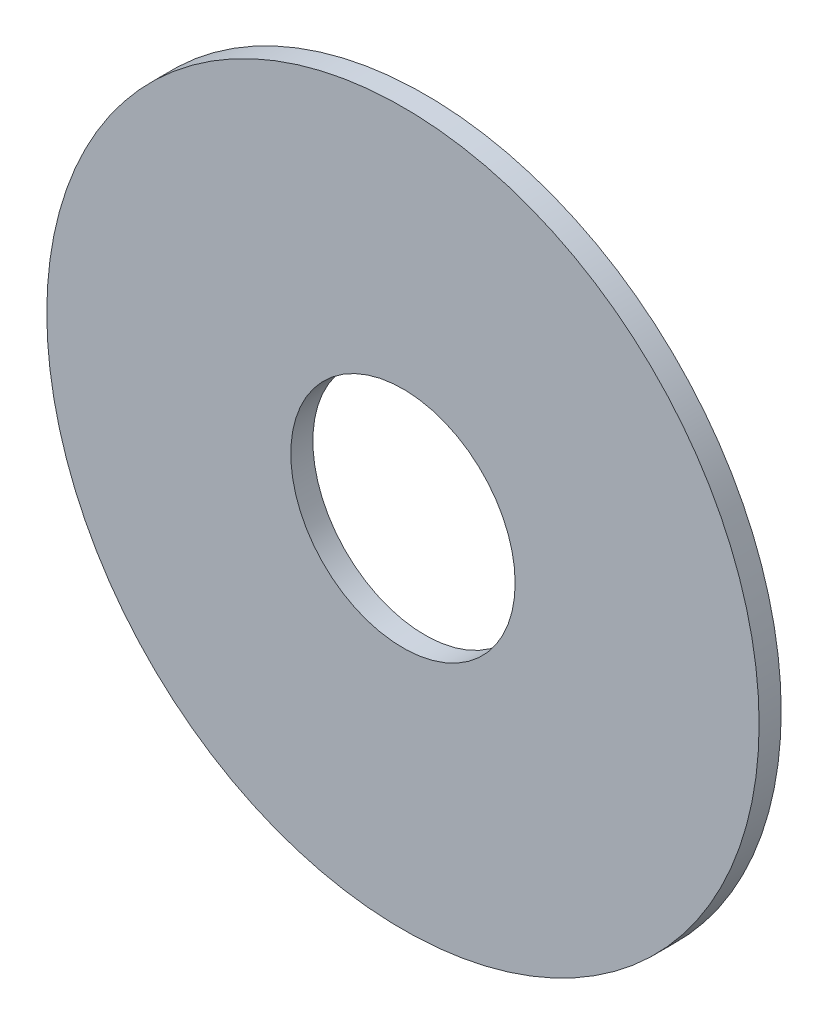
ISO-10303-21;
HEADER;
FILE_DESCRIPTION(('STEP AP214'),'2;1');
FILE_NAME('part.step','',(''),(''),'','','');
FILE_SCHEMA(('AUTOMOTIVE_DESIGN { 1 0 10303 214 1 1 1 1 }'));
ENDSEC;
DATA;
#1=APPLICATION_CONTEXT('core data for automotive mechanical design processes');
#2=APPLICATION_PROTOCOL_DEFINITION('international standard','automotive_design',2000,#1);
#3=PRODUCT_CONTEXT('',#1,'mechanical');
#4=PRODUCT('Part','Part','',(#3));
#5=PRODUCT_RELATED_PRODUCT_CATEGORY('part','',(#4));
#6=PRODUCT_DEFINITION_FORMATION('','',#4);
#7=PRODUCT_DEFINITION_CONTEXT('part definition',#1,'design');
#8=PRODUCT_DEFINITION('design','',#6,#7);
#9=PRODUCT_DEFINITION_SHAPE('','',#8);
#10=(LENGTH_UNIT() NAMED_UNIT(*) SI_UNIT(.MILLI.,.METRE.));
#11=(NAMED_UNIT(*) PLANE_ANGLE_UNIT() SI_UNIT($,.RADIAN.));
#12=(NAMED_UNIT(*) SI_UNIT($,.STERADIAN.) SOLID_ANGLE_UNIT());
#13=UNCERTAINTY_MEASURE_WITH_UNIT(LENGTH_MEASURE(1.E-05),#10,'distance_accuracy_value','');
#14=(GEOMETRIC_REPRESENTATION_CONTEXT(3) GLOBAL_UNCERTAINTY_ASSIGNED_CONTEXT((#13)) GLOBAL_UNIT_ASSIGNED_CONTEXT((#10,
#11,#12)) REPRESENTATION_CONTEXT('',''));
#15=CARTESIAN_POINT('',(0.,0.,0.));
#16=DIRECTION('',(0.,0.,1.));
#17=DIRECTION('',(1.,0.,0.));
#18=AXIS2_PLACEMENT_3D('',#15,#16,#17);
#19=CARTESIAN_POINT('',(0.,0.,0.7874));
#20=DIRECTION('',(0.,0.,-1.));
#21=DIRECTION('',(-1.,0.,0.));
#22=AXIS2_PLACEMENT_3D('',#19,#20,#21);
#23=CYLINDRICAL_SURFACE('',#22,4.0005);
#24=CARTESIAN_POINT('',(0.,0.,0.7874));
#25=DIRECTION('',(0.,0.,1.));
#26=DIRECTION('',(1.,0.,0.));
#27=AXIS2_PLACEMENT_3D('',#24,#25,#26);
#28=CIRCLE('',#27,4.0005);
#29=CARTESIAN_POINT('',(4.0005,0.,0.7874));
#30=VERTEX_POINT('',#29);
#31=EDGE_CURVE('E37',#30,#30,#28,.T.);
#32=ORIENTED_EDGE('',*,*,#31,.T.);
#33=EDGE_LOOP('',(#32));
#34=FACE_BOUND('',#33,.T.);
#35=CARTESIAN_POINT('',(0.,0.,0.));
#36=DIRECTION('',(0.,0.,1.));
#37=DIRECTION('',(1.,0.,0.));
#38=AXIS2_PLACEMENT_3D('',#35,#36,#37);
#39=CIRCLE('',#38,4.0005);
#40=CARTESIAN_POINT('',(4.0005,0.,0.));
#41=VERTEX_POINT('',#40);
#42=EDGE_CURVE('E45',#41,#41,#39,.T.);
#43=ORIENTED_EDGE('',*,*,#42,.F.);
#44=EDGE_LOOP('',(#43));
#45=FACE_BOUND('',#44,.T.);
#46=ADVANCED_FACE('F31',(#34,#45),#23,.F.);
#47=CARTESIAN_POINT('',(0.,0.,0.7874));
#48=DIRECTION('',(0.,0.,-1.));
#49=DIRECTION('',(-1.,0.,0.));
#50=AXIS2_PLACEMENT_3D('',#47,#48,#49);
#51=CYLINDRICAL_SURFACE('',#50,12.7);
#52=CARTESIAN_POINT('',(0.,0.,0.7874));
#53=DIRECTION('',(0.,0.,1.));
#54=DIRECTION('',(1.,0.,0.));
#55=AXIS2_PLACEMENT_3D('',#52,#53,#54);
#56=CIRCLE('',#55,12.7);
#57=CARTESIAN_POINT('',(12.7,0.,0.7874));
#58=VERTEX_POINT('',#57);
#59=EDGE_CURVE('E10',#58,#58,#56,.T.);
#60=ORIENTED_EDGE('',*,*,#59,.F.);
#61=EDGE_LOOP('',(#60));
#62=FACE_BOUND('',#61,.T.);
#63=CARTESIAN_POINT('',(0.,0.,0.));
#64=DIRECTION('',(0.,0.,1.));
#65=DIRECTION('',(1.,0.,0.));
#66=AXIS2_PLACEMENT_3D('',#63,#64,#65);
#67=CIRCLE('',#66,12.7);
#68=CARTESIAN_POINT('',(12.7,0.,0.));
#69=VERTEX_POINT('',#68);
#70=EDGE_CURVE('E41',#69,#69,#67,.T.);
#71=ORIENTED_EDGE('',*,*,#70,.T.);
#72=EDGE_LOOP('',(#71));
#73=FACE_BOUND('',#72,.T.);
#74=ADVANCED_FACE('F55',(#62,#73),#51,.T.);
#75=CARTESIAN_POINT('',(0.,-28.0814213562373,0.7874));
#76=DIRECTION('',(0.,0.,1.));
#77=DIRECTION('',(1.,0.,0.));
#78=AXIS2_PLACEMENT_3D('',#75,#76,#77);
#79=PLANE('',#78);
#80=ORIENTED_EDGE('',*,*,#31,.F.);
#81=EDGE_LOOP('',(#80));
#82=FACE_BOUND('',#81,.T.);
#83=ORIENTED_EDGE('',*,*,#59,.T.);
#84=EDGE_LOOP('',(#83));
#85=FACE_BOUND('',#84,.T.);
#86=ADVANCED_FACE('F59',(#82,#85),#79,.T.);
#87=CARTESIAN_POINT('',(0.,-28.0814213562373,0.));
#88=DIRECTION('',(0.,0.,1.));
#89=DIRECTION('',(1.,0.,0.));
#90=AXIS2_PLACEMENT_3D('',#87,#88,#89);
#91=PLANE('',#90);
#92=ORIENTED_EDGE('',*,*,#42,.T.);
#93=EDGE_LOOP('',(#92));
#94=FACE_BOUND('',#93,.T.);
#95=ORIENTED_EDGE('',*,*,#70,.F.);
#96=EDGE_LOOP('',(#95));
#97=FACE_BOUND('',#96,.T.);
#98=ADVANCED_FACE('F51',(#94,#97),#91,.F.);
#99=CLOSED_SHELL('',(#46,#74,#86,#98));
#100=MANIFOLD_SOLID_BREP('B2',#99);
#101=ADVANCED_BREP_SHAPE_REPRESENTATION('',(#18,#100),#14);
#102=SHAPE_DEFINITION_REPRESENTATION(#9,#101);
ENDSEC;
END-ISO-10303-21;
